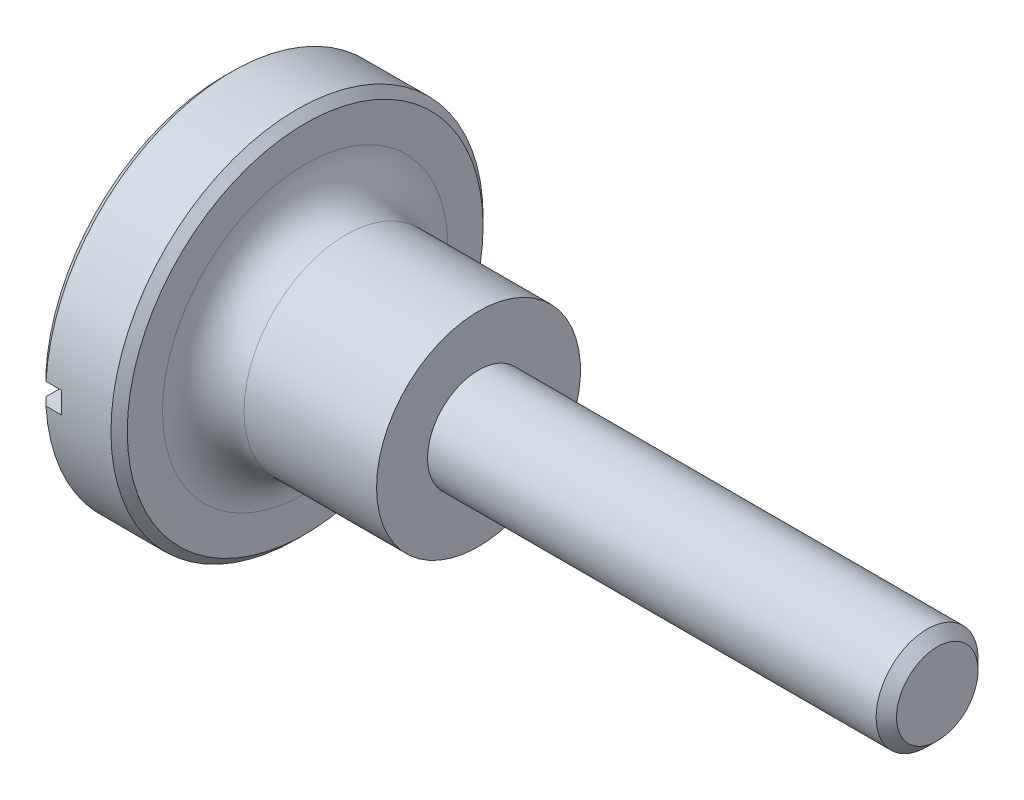
ISO-10303-21;
HEADER;
FILE_DESCRIPTION(('STEP AP214'),'2;1');
FILE_NAME('part.step','',(''),(''),'','','');
FILE_SCHEMA(('AUTOMOTIVE_DESIGN { 1 0 10303 214 1 1 1 1 }'));
ENDSEC;
DATA;
#1=APPLICATION_CONTEXT('core data for automotive mechanical design processes');
#2=APPLICATION_PROTOCOL_DEFINITION('international standard','automotive_design',2000,#1);
#3=PRODUCT_CONTEXT('',#1,'mechanical');
#4=PRODUCT('Part','Part','',(#3));
#5=PRODUCT_RELATED_PRODUCT_CATEGORY('part','',(#4));
#6=PRODUCT_DEFINITION_FORMATION('','',#4);
#7=PRODUCT_DEFINITION_CONTEXT('part definition',#1,'design');
#8=PRODUCT_DEFINITION('design','',#6,#7);
#9=PRODUCT_DEFINITION_SHAPE('','',#8);
#10=(LENGTH_UNIT() NAMED_UNIT(*) SI_UNIT(.MILLI.,.METRE.));
#11=(NAMED_UNIT(*) PLANE_ANGLE_UNIT() SI_UNIT($,.RADIAN.));
#12=(NAMED_UNIT(*) SI_UNIT($,.STERADIAN.) SOLID_ANGLE_UNIT());
#13=UNCERTAINTY_MEASURE_WITH_UNIT(LENGTH_MEASURE(1.E-05),#10,'distance_accuracy_value','');
#14=(GEOMETRIC_REPRESENTATION_CONTEXT(3) GLOBAL_UNCERTAINTY_ASSIGNED_CONTEXT((#13)) GLOBAL_UNIT_ASSIGNED_CONTEXT((#10,
#11,#12)) REPRESENTATION_CONTEXT('',''));
#15=CARTESIAN_POINT('',(0.,0.,0.));
#16=DIRECTION('',(0.,0.,1.));
#17=DIRECTION('',(1.,0.,0.));
#18=AXIS2_PLACEMENT_3D('',#15,#16,#17);
#19=CARTESIAN_POINT('',(0.799999999999999,0.,0.));
#20=DIRECTION('',(1.,0.,0.));
#21=DIRECTION('',(0.,0.,-1.));
#22=AXIS2_PLACEMENT_3D('',#19,#20,#21);
#23=CONICAL_SURFACE('',#22,18.25,0.785398163397448);
#24=CARTESIAN_POINT('',(0.799999999999999,0.,0.));
#25=DIRECTION('',(-1.,0.,0.));
#26=DIRECTION('',(0.,0.,1.));
#27=AXIS2_PLACEMENT_3D('',#24,#25,#26);
#28=CIRCLE('',#27,18.25);
#29=CARTESIAN_POINT('',(0.799999999999998,1.05069502627557,18.2197294151631));
#30=VERTEX_POINT('',#29);
#31=CARTESIAN_POINT('',(0.799999999999998,1.05069502627557,-18.2197294151631));
#32=VERTEX_POINT('',#31);
#33=EDGE_CURVE('E163',#30,#32,#28,.T.);
#34=ORIENTED_EDGE('',*,*,#33,.T.);
#35=CARTESIAN_POINT('',(22.7054596423781,1.05069502627557,-40.141711212309));
#36=CARTESIAN_POINT('',(21.3218955090069,1.05069502627557,-38.7576692769317));
#37=CARTESIAN_POINT('',(19.9383521895843,1.05069502627557,-37.3736065317238));
#38=CARTESIAN_POINT('',(17.1713337692233,1.05069502627557,-34.6054114647262));
#39=CARTESIAN_POINT('',(15.7878586683194,1.05069502627557,-33.221279142902));
#40=CARTESIAN_POINT('',(13.0209888236895,1.05069502627557,-30.4529025056026));
#41=CARTESIAN_POINT('',(11.637594081065,1.05069502627557,-29.0686581890265));
#42=CARTESIAN_POINT('',(8.87095102702407,1.05069502627557,-26.3000245733637));
#43=CARTESIAN_POINT('',(7.48770271553655,1.05069502627557,-24.9156352743482));
#44=CARTESIAN_POINT('',(4.71691298519449,1.05069502627557,-22.1420843913738));
#45=CARTESIAN_POINT('',(3.32937234539765,1.05069502627557,-20.7529220291287));
#46=CARTESIAN_POINT('',(0.554702480333594,1.05069502627557,-17.9741824319161));
#47=CARTESIAN_POINT('',(-0.832426744342287,1.05069502627557,-16.584605196358));
#48=CARTESIAN_POINT('',(-2.91246387448338,1.05069502627557,-14.4995940597288));
#49=CARTESIAN_POINT('',(-3.60569764985362,1.05069502627557,-13.8044852928888));
#50=CARTESIAN_POINT('',(-4.99181820407278,1.05069502627557,-12.4139210679398));
#51=CARTESIAN_POINT('',(-5.68470498272254,1.05069502627557,-11.7184656096322));
#52=CARTESIAN_POINT('',(-7.06991038127239,1.05069502627557,-10.3269924387228));
#53=CARTESIAN_POINT('',(-7.76222900267128,1.05069502627557,-9.63097472761383));
#54=CARTESIAN_POINT('',(-8.79989856545217,1.05069502627557,-8.58614586757556));
#55=CARTESIAN_POINT('',(-9.14565353097132,1.05069502627557,-8.23773602746357));
#56=CARTESIAN_POINT('',(-9.83676739853523,1.05069502627557,-7.54052380410372));
#57=CARTESIAN_POINT('',(-10.1821263007141,1.05069502627557,-7.19172142098885));
#58=CARTESIAN_POINT('',(-10.7159639305549,1.05069502627557,-6.65162469528891));
#59=CARTESIAN_POINT('',(-10.9046548503662,1.05069502627557,-6.46054011130738));
#60=CARTESIAN_POINT('',(-11.2817992041306,1.05069502627557,-6.07813646781248));
#61=CARTESIAN_POINT('',(-11.4702526379446,1.05069502627557,-5.88681740816187));
#62=CARTESIAN_POINT('',(-11.8467750718534,1.05069502627557,-5.50394231097374));
#63=CARTESIAN_POINT('',(-12.0348441896145,1.05069502627557,-5.31238638921506));
#64=CARTESIAN_POINT('',(-12.4105497445625,1.05069502627557,-4.92885122343311));
#65=CARTESIAN_POINT('',(-12.5981861822786,1.05069502627557,-4.73687197992837));
#66=CARTESIAN_POINT('',(-13.0361596107767,1.05069502627557,-4.28735976639499));
#67=CARTESIAN_POINT('',(-13.2862597171927,1.05069502627557,-4.02959543907187));
#68=CARTESIAN_POINT('',(-13.6600997883479,1.05069502627557,-3.64150646036757));
#69=CARTESIAN_POINT('',(-13.7845392226394,1.05069502627557,-3.51185626275503));
#70=CARTESIAN_POINT('',(-14.0327604671652,1.05069502627557,-3.2519299203883));
#71=CARTESIAN_POINT('',(-14.1565422820007,1.05069502627557,-3.12165378002593));
#72=CARTESIAN_POINT('',(-14.4450744670868,1.05069502627557,-2.8158579478936));
#73=CARTESIAN_POINT('',(-14.6094642817693,1.05069502627557,-2.63999599520794));
#74=CARTESIAN_POINT('',(-14.8537361720474,1.05069502627557,-2.37440544554177));
#75=CARTESIAN_POINT('',(-14.9346935345884,1.05069502627557,-2.28566677898999));
#76=CARTESIAN_POINT('',(-15.0956109094812,1.05069502627557,-2.10729289004238));
#77=CARTESIAN_POINT('',(-15.175570960857,1.05069502627557,-2.0176577029756));
#78=CARTESIAN_POINT('',(-15.3078557225913,1.05069502627557,-1.86699022439624));
#79=CARTESIAN_POINT('',(-15.3605734224291,1.05069502627557,-1.80630336848669));
#80=CARTESIAN_POINT('',(-15.4651721390286,1.05069502627557,-1.68421365297166));
#81=CARTESIAN_POINT('',(-15.5170531768065,1.05069502627557,-1.62281081141801));
#82=CARTESIAN_POINT('',(-15.6200289076893,1.05069502627557,-1.49868100476498));
#83=CARTESIAN_POINT('',(-15.6711164408263,1.05069502627557,-1.4359480794767));
#84=CARTESIAN_POINT('',(-15.7717279960132,1.05069502627557,-1.30924488933983));
#85=CARTESIAN_POINT('',(-15.821252186291,1.05069502627557,-1.24527475882706));
#86=CARTESIAN_POINT('',(-15.91873580845,1.05069502627557,-1.11477529236224));
#87=CARTESIAN_POINT('',(-15.9666646656014,1.05069502627557,-1.04822294559038));
#88=CARTESIAN_POINT('',(-16.0591623796834,1.05069502627557,-0.91265187122596));
#89=CARTESIAN_POINT('',(-16.1037266087394,1.05069502627557,-0.843629932346555));
#90=CARTESIAN_POINT('',(-16.1870616735425,1.05069502627557,-0.703026328508115));
#91=CARTESIAN_POINT('',(-16.2258845802967,1.05069502627557,-0.631476041085821));
#92=CARTESIAN_POINT('',(-16.2948566347539,1.05069502627557,-0.484334169730715));
#93=CARTESIAN_POINT('',(-16.3250332401389,1.05069502627557,-0.40875630360844));
#94=CARTESIAN_POINT('',(-16.359046949098,1.05069502627557,-0.2955740700368));
#95=CARTESIAN_POINT('',(-16.368293533681,1.05069502627557,-0.259602036996158));
#96=CARTESIAN_POINT('',(-16.383395126019,1.05069502627557,-0.186941871963766));
#97=CARTESIAN_POINT('',(-16.3892506059917,1.05069502627557,-0.150253840411986));
#98=CARTESIAN_POINT('',(-16.3971456964461,1.05069502627557,-0.076639264728557));
#99=CARTESIAN_POINT('',(-16.3992034455131,1.05069502627557,-0.0397147040488211));
#100=CARTESIAN_POINT('',(-16.3993991244039,1.05069502627557,0.0341463833579337));
#101=CARTESIAN_POINT('',(-16.3975369438116,1.05069502627557,0.0710829103927176));
#102=CARTESIAN_POINT('',(-16.3900577566977,1.05069502627557,0.144360866685056));
#103=CARTESIAN_POINT('',(-16.3844613479603,1.05069502627557,0.180704446113591));
#104=CARTESIAN_POINT('',(-16.3699163978638,1.05069502627557,0.252717641946318));
#105=CARTESIAN_POINT('',(-16.3609664169376,1.05069502627557,0.288386961998196));
#106=CARTESIAN_POINT('',(-16.3401510082542,1.05069502627557,0.359103959469757));
#107=CARTESIAN_POINT('',(-16.3282669840914,1.05069502627557,0.39414607982119));
#108=CARTESIAN_POINT('',(-16.3021331386188,1.05069502627557,0.463317303370552));
#109=CARTESIAN_POINT('',(-16.2878836994788,1.05069502627557,0.497446553024417));
#110=CARTESIAN_POINT('',(-16.2453698848379,1.05069502627557,0.591696183221425));
#111=CARTESIAN_POINT('',(-16.2149856956362,1.05069502627557,0.650856474039938));
#112=CARTESIAN_POINT('',(-16.1500902100597,1.05069502627557,0.766888218818552));
#113=CARTESIAN_POINT('',(-16.1155743137932,1.05069502627557,0.823757025736368));
#114=CARTESIAN_POINT('',(-16.0435935142637,1.05069502627557,0.935879540283397));
#115=CARTESIAN_POINT('',(-16.0061181110628,1.05069502627557,0.991126447260319));
#116=CARTESIAN_POINT('',(-15.9291910371676,1.05069502627557,1.10017737966071));
#117=CARTESIAN_POINT('',(-15.8897402398733,1.05069502627557,1.15398202688759));
#118=CARTESIAN_POINT('',(-15.8090139079938,1.05069502627557,1.26099932527588));
#119=CARTESIAN_POINT('',(-15.7677246509738,1.05069502627557,1.31420157461681));
#120=CARTESIAN_POINT('',(-15.684047699361,1.05069502627557,1.41973949479999));
#121=CARTESIAN_POINT('',(-15.6416599055513,1.05069502627557,1.47207508666345));
#122=CARTESIAN_POINT('',(-15.5561519971261,1.05069502627557,1.57593353566253));
#123=CARTESIAN_POINT('',(-15.5130338701213,1.05069502627557,1.62745803342224));
#124=CARTESIAN_POINT('',(-15.4261510066102,1.05069502627557,1.72995410815996));
#125=CARTESIAN_POINT('',(-15.3823862967691,1.05069502627557,1.78092570779018));
#126=CARTESIAN_POINT('',(-15.2522627794616,1.05069502627557,1.93094394039141));
#127=CARTESIAN_POINT('',(-15.165182867769,1.05069502627557,2.02936467284357));
#128=CARTESIAN_POINT('',(-14.9897287944959,1.05069502627557,2.22504752864071));
#129=CARTESIAN_POINT('',(-14.901354575936,1.05069502627557,2.32230960063414));
#130=CARTESIAN_POINT('',(-14.7236859357996,1.05069502627557,2.51601215901551));
#131=CARTESIAN_POINT('',(-14.6343913945296,1.05069502627557,2.61245253548014));
#132=CARTESIAN_POINT('',(-14.4551394078056,1.05069502627557,2.80471574176896));
#133=CARTESIAN_POINT('',(-14.3651819566941,1.05069502627557,2.90053856630961));
#134=CARTESIAN_POINT('',(-14.0943601248874,1.05069502627557,3.18754022202574));
#135=CARTESIAN_POINT('',(-13.9127583654684,1.05069502627557,3.37802279228208));
#136=CARTESIAN_POINT('',(-13.5483954860556,1.05069502627557,3.75784378977503));
#137=CARTESIAN_POINT('',(-13.3656344574804,1.05069502627557,3.94718230498658));
#138=CARTESIAN_POINT('',(-13.000850168885,1.05069502627557,4.32355192227148));
#139=CARTESIAN_POINT('',(-12.8188332533627,1.05069502627557,4.51058917654747));
#140=CARTESIAN_POINT('',(-12.454272708425,1.05069502627557,4.88415662469749));
#141=CARTESIAN_POINT('',(-12.2717290684099,1.05069502627557,5.07068680821838));
#142=CARTESIAN_POINT('',(-11.9063556429252,1.05069502627557,5.44328614712869));
#143=CARTESIAN_POINT('',(-11.7235260430244,1.05069502627557,5.62935548454737));
#144=CARTESIAN_POINT('',(-11.3575880717067,1.05069502627557,6.00121730513887));
#145=CARTESIAN_POINT('',(-11.1744797021521,1.05069502627557,6.1870097901447));
#146=CARTESIAN_POINT('',(-10.6244201687919,1.05069502627557,6.7444996864077));
#147=CARTESIAN_POINT('',(-10.2571521391073,1.05069502627557,7.11588441384723));
#148=CARTESIAN_POINT('',(-9.52209469292365,1.05069502627557,7.85813763147141));
#149=CARTESIAN_POINT('',(-9.15430527611094,1.05069502627557,8.22900612134518));
#150=CARTESIAN_POINT('',(-8.05042435817209,1.05069502627557,9.34110840041143));
#151=CARTESIAN_POINT('',(-7.31382306921161,1.05069502627557,10.0818360872758));
#152=CARTESIAN_POINT('',(-5.83981087988442,1.05069502627557,11.5627613032011));
#153=CARTESIAN_POINT('',(-5.10239985368051,1.05069502627557,12.3029587069204));
#154=CARTESIAN_POINT('',(-3.62718167940806,1.05069502627557,13.7829563159493));
#155=CARTESIAN_POINT('',(-2.88937453197535,1.05069502627557,14.5227565218927));
#156=CARTESIAN_POINT('',(-1.41109299203526,1.05069502627557,16.0045353244227));
#157=CARTESIAN_POINT('',(-0.670617786444525,1.05069502627557,16.7465131097033));
#158=CARTESIAN_POINT('',(0.810500759873604,1.05069502627557,18.230301477086));
#159=CARTESIAN_POINT('',(1.55114410067279,1.05069502627557,18.9721120591165));
#160=CARTESIAN_POINT('',(3.77316906063362,1.05069502627557,21.197293849754));
#161=CARTESIAN_POINT('',(5.25472316592608,1.05069502627557,22.6804928098259));
#162=CARTESIAN_POINT('',(8.06896911100145,1.05069502627557,25.4973934249849));
#163=CARTESIAN_POINT('',(9.40163731628034,1.05069502627557,26.8311186948468));
#164=CARTESIAN_POINT('',(12.0671260134411,1.05069502627557,29.4984618039457));
#165=CARTESIAN_POINT('',(13.3999465075041,1.05069502627557,30.8320796410031));
#166=CARTESIAN_POINT('',(16.061525884497,1.05069502627557,33.4950786089805));
#167=CARTESIAN_POINT('',(17.3902844987594,1.05069502627557,34.8244600084325));
#168=CARTESIAN_POINT('',(20.0478420667661,1.05069502627557,37.4831378970394));
#169=CARTESIAN_POINT('',(21.3766410194597,1.05069502627557,38.8124343872447));
#170=CARTESIAN_POINT('',(22.7054596423781,1.05069502627557,40.141711212309));
#171=B_SPLINE_CURVE_WITH_KNOTS('',3,(#35,#36,#37,#38,#39,#40,#41,#42,#43,#44,#45,#46,#47,#48,
#49,#50,#51,#52,#53,#54,#55,#56,#57,#58,#59,#60,#61,#62,#63,#64,#65,#66,#67,#68,#69,#70,#71,#72,
#73,#74,#75,#76,#77,#78,#79,#80,#81,#82,#83,#84,#85,#86,#87,#88,#89,#90,#91,#92,#93,#94,#95,#96,
#97,#98,#99,#100,#101,#102,#103,#104,#105,#106,#107,#108,#109,#110,#111,#112,#113,#114,#115,
#116,#117,#118,#119,#120,#121,#122,#123,#124,#125,#126,#127,#128,#129,#130,#131,#132,#133,#134,
#135,#136,#137,#138,#139,#140,#141,#142,#143,#144,#145,#146,#147,#148,#149,#150,#151,#152,#153,
#154,#155,#156,#157,#158,#159,#160,#161,#162,#163,#164,#165,#166,#167,#168,#169,#170),
.UNSPECIFIED.,.F.,.F.,(4,2,2,2,2,2,2,2,2,2,2,2,2,2,2,2,2,2,2,2,2,2,2,2,2,2,2,2,2,2,2,2,2,2,2,2,
2,2,2,2,2,2,2,2,2,2,2,2,2,2,2,2,2,2,2,2,2,2,2,2,2,2,2,2,2,2,2,4),(0.,5.87097914730624,
11.7419612386698,17.6130105498529,23.4840569937888,29.3743345399984,35.2646205116594,
38.2097423855863,41.1548659480556,44.0999817161878,45.5725382313445,47.045094247694,
47.8507355932612,48.6563774105971,49.4617170955565,50.2670557946135,51.3445152541151,
51.8836320961762,52.4227451611202,53.1449153550438,53.5052685362452,53.8656075725811,
54.1067626927622,54.3479117458949,54.5906045377739,54.8332711243757,55.0792491369838,
55.325559538799,55.5694773240897,55.8126117004144,55.923901368413,56.0351755353907,
56.1459168494792,56.2566612829579,56.3667998514488,56.4769857527061,56.5878888125356,
56.6987739716502,56.8980182640572,57.0974864780867,57.2976972530312,57.4978202753432,
57.6998347796391,57.9018675933852,58.1034185773956,58.3049612724452,58.6991822632134,
59.0934206612392,59.4877109960472,59.8820046997897,60.6715294294929,61.4609926537189,
62.2439456090628,63.0269144321019,63.8094970300561,64.592074423425,66.1590168796825,
67.7259602791218,70.8598593636645,73.9943456500922,77.12882692013,80.2735861948392,
83.4183468148428,89.707538708076,95.3638138680699,101.020183990369,106.658950630273,
112.297622664435),.UNSPECIFIED.);
#172=CARTESIAN_POINT('',(0.,1.05069502627557,-17.4183391849441));
#173=VERTEX_POINT('',#172);
#174=EDGE_CURVE('E55',#32,#173,#171,.T.);
#175=ORIENTED_EDGE('',*,*,#174,.T.);
#176=CARTESIAN_POINT('',(0.,0.,0.));
#177=DIRECTION('',(-1.,0.,0.));
#178=DIRECTION('',(0.,0.,1.));
#179=AXIS2_PLACEMENT_3D('',#176,#177,#178);
#180=CIRCLE('',#179,17.45);
#181=CARTESIAN_POINT('',(0.,1.05069502627557,17.4183391849441));
#182=VERTEX_POINT('',#181);
#183=EDGE_CURVE('E172',#182,#173,#180,.T.);
#184=ORIENTED_EDGE('',*,*,#183,.F.);
#185=EDGE_CURVE('E109',#182,#30,#171,.T.);
#186=ORIENTED_EDGE('',*,*,#185,.T.);
#187=EDGE_LOOP('',(#34,#175,#184,#186));
#188=FACE_BOUND('',#187,.T.);
#189=ADVANCED_FACE('F32',(#188),#23,.T.);
#190=CARTESIAN_POINT('',(0.,0.,0.));
#191=DIRECTION('',(-1.,0.,0.));
#192=DIRECTION('',(0.,0.,1.));
#193=AXIS2_PLACEMENT_3D('',#190,#191,#192);
#194=PLANE('',#193);
#195=DIRECTION('',(0.,0.,-1.));
#196=VECTOR('',#195,1.);
#197=CARTESIAN_POINT('',(0.,1.05069502627557,0.));
#198=LINE('',#197,#196);
#199=EDGE_CURVE('E186',#182,#173,#198,.T.);
#200=ORIENTED_EDGE('',*,*,#199,.F.);
#201=ORIENTED_EDGE('',*,*,#183,.T.);
#202=EDGE_LOOP('',(#200,#201));
#203=FACE_BOUND('',#202,.T.);
#204=ADVANCED_FACE('F149',(#203),#194,.T.);
#205=CARTESIAN_POINT('',(-25.4,0.,0.));
#206=DIRECTION('',(-1.,0.,0.));
#207=DIRECTION('',(0.,0.,1.));
#208=AXIS2_PLACEMENT_3D('',#205,#206,#207);
#209=CYLINDRICAL_SURFACE('',#208,5.);
#210=CARTESIAN_POINT('',(69.,0.,0.));
#211=DIRECTION('',(-1.,0.,0.));
#212=DIRECTION('',(0.,0.,1.));
#213=AXIS2_PLACEMENT_3D('',#210,#211,#212);
#214=CIRCLE('',#213,5.);
#215=CARTESIAN_POINT('',(69.,0.,5.));
#216=VERTEX_POINT('',#215);
#217=EDGE_CURVE('E315',#216,#216,#214,.T.);
#218=ORIENTED_EDGE('',*,*,#217,.T.);
#219=EDGE_LOOP('',(#218));
#220=FACE_BOUND('',#219,.T.);
#221=CARTESIAN_POINT('',(25.,0.,0.));
#222=DIRECTION('',(-1.,0.,0.));
#223=DIRECTION('',(0.,0.,1.));
#224=AXIS2_PLACEMENT_3D('',#221,#222,#223);
#225=CIRCLE('',#224,5.);
#226=CARTESIAN_POINT('',(25.,0.,5.));
#227=VERTEX_POINT('',#226);
#228=EDGE_CURVE('E181',#227,#227,#225,.T.);
#229=ORIENTED_EDGE('',*,*,#228,.F.);
#230=EDGE_LOOP('',(#229));
#231=FACE_BOUND('',#230,.T.);
#232=ADVANCED_FACE('F155',(#220,#231),#209,.T.);
#233=CARTESIAN_POINT('',(25.,9.99999999999999,0.));
#234=DIRECTION('',(1.,0.,0.));
#235=DIRECTION('',(0.,0.,-1.));
#236=AXIS2_PLACEMENT_3D('',#233,#234,#235);
#237=PLANE('',#236);
#238=ORIENTED_EDGE('',*,*,#228,.T.);
#239=EDGE_LOOP('',(#238));
#240=FACE_BOUND('',#239,.T.);
#241=CARTESIAN_POINT('',(25.,0.,0.));
#242=DIRECTION('',(-1.,0.,0.));
#243=DIRECTION('',(0.,0.,1.));
#244=AXIS2_PLACEMENT_3D('',#241,#242,#243);
#245=CIRCLE('',#244,9.99999999999999);
#246=CARTESIAN_POINT('',(25.,0.,9.99999999999999));
#247=VERTEX_POINT('',#246);
#248=EDGE_CURVE('E178',#247,#247,#245,.T.);
#249=ORIENTED_EDGE('',*,*,#248,.F.);
#250=EDGE_LOOP('',(#249));
#251=FACE_BOUND('',#250,.T.);
#252=ADVANCED_FACE('F202',(#240,#251),#237,.T.);
#253=CARTESIAN_POINT('',(-25.4,0.,0.));
#254=DIRECTION('',(-1.,0.,0.));
#255=DIRECTION('',(0.,0.,1.));
#256=AXIS2_PLACEMENT_3D('',#253,#254,#255);
#257=CYLINDRICAL_SURFACE('',#256,9.99999999999999);
#258=CARTESIAN_POINT('',(12.,0.,0.));
#259=DIRECTION('',(-1.,0.,0.));
#260=DIRECTION('',(0.,0.,1.));
#261=AXIS2_PLACEMENT_3D('',#258,#259,#260);
#262=CIRCLE('',#261,9.99999999999999);
#263=CARTESIAN_POINT('',(12.,0.,9.99999999999999));
#264=VERTEX_POINT('',#263);
#265=EDGE_CURVE('E11',#264,#264,#262,.F.);
#266=ORIENTED_EDGE('',*,*,#265,.T.);
#267=EDGE_LOOP('',(#266));
#268=FACE_BOUND('',#267,.T.);
#269=ORIENTED_EDGE('',*,*,#248,.T.);
#270=EDGE_LOOP('',(#269));
#271=FACE_BOUND('',#270,.T.);
#272=ADVANCED_FACE('F199',(#268,#271),#257,.T.);
#273=CARTESIAN_POINT('',(8.,9.99999999999999,0.));
#274=DIRECTION('',(-1.,0.,0.));
#275=DIRECTION('',(0.,0.,1.));
#276=AXIS2_PLACEMENT_3D('',#273,#274,#275);
#277=PLANE('',#276);
#278=CARTESIAN_POINT('',(8.,0.,0.));
#279=DIRECTION('',(-1.,0.,0.));
#280=DIRECTION('',(0.,0.,1.));
#281=AXIS2_PLACEMENT_3D('',#278,#279,#280);
#282=CIRCLE('',#281,14.);
#283=CARTESIAN_POINT('',(8.,0.,14.));
#284=VERTEX_POINT('',#283);
#285=EDGE_CURVE('E40',#284,#284,#282,.T.);
#286=ORIENTED_EDGE('',*,*,#285,.T.);
#287=EDGE_LOOP('',(#286));
#288=FACE_BOUND('',#287,.T.);
#289=CARTESIAN_POINT('',(7.99999999999999,0.,0.));
#290=DIRECTION('',(-1.,0.,0.));
#291=DIRECTION('',(0.,0.,1.));
#292=AXIS2_PLACEMENT_3D('',#289,#290,#291);
#293=CIRCLE('',#292,17.45);
#294=CARTESIAN_POINT('',(7.99999999999999,0.,17.45));
#295=VERTEX_POINT('',#294);
#296=EDGE_CURVE('E170',#295,#295,#293,.T.);
#297=ORIENTED_EDGE('',*,*,#296,.F.);
#298=EDGE_LOOP('',(#297));
#299=FACE_BOUND('',#298,.T.);
#300=ADVANCED_FACE('F190',(#288,#299),#277,.F.);
#301=CARTESIAN_POINT('',(7.2,0.,0.));
#302=DIRECTION('',(-1.,0.,0.));
#303=DIRECTION('',(0.,0.,1.));
#304=AXIS2_PLACEMENT_3D('',#301,#302,#303);
#305=CONICAL_SURFACE('',#304,18.25,0.785398163397453);
#306=ORIENTED_EDGE('',*,*,#296,.T.);
#307=EDGE_LOOP('',(#306));
#308=FACE_BOUND('',#307,.T.);
#309=CARTESIAN_POINT('',(7.2,0.,0.));
#310=DIRECTION('',(-1.,0.,0.));
#311=DIRECTION('',(0.,0.,1.));
#312=AXIS2_PLACEMENT_3D('',#309,#310,#311);
#313=CIRCLE('',#312,18.25);
#314=CARTESIAN_POINT('',(7.2,0.,18.25));
#315=VERTEX_POINT('',#314);
#316=EDGE_CURVE('E167',#315,#315,#313,.T.);
#317=ORIENTED_EDGE('',*,*,#316,.F.);
#318=EDGE_LOOP('',(#317));
#319=FACE_BOUND('',#318,.T.);
#320=ADVANCED_FACE('F216',(#308,#319),#305,.T.);
#321=CARTESIAN_POINT('',(-25.4,0.,0.));
#322=DIRECTION('',(-1.,0.,0.));
#323=DIRECTION('',(0.,0.,1.));
#324=AXIS2_PLACEMENT_3D('',#321,#322,#323);
#325=CYLINDRICAL_SURFACE('',#324,18.25);
#326=DIRECTION('',(-1.,0.,0.));
#327=VECTOR('',#326,1.);
#328=CARTESIAN_POINT('',(-25.4,1.05069502627557,-18.2197294151631));
#329=LINE('',#328,#327);
#330=CARTESIAN_POINT('',(2.34655222534877,1.05069502627557,-18.2197294151631));
#331=VERTEX_POINT('',#330);
#332=EDGE_CURVE('E318',#32,#331,#329,.F.);
#333=ORIENTED_EDGE('',*,*,#332,.F.);
#334=ORIENTED_EDGE('',*,*,#33,.F.);
#335=DIRECTION('',(-1.,0.,0.));
#336=VECTOR('',#335,1.);
#337=CARTESIAN_POINT('',(-25.4,1.05069502627557,18.2197294151631));
#338=LINE('',#337,#336);
#339=CARTESIAN_POINT('',(2.34655222534877,1.05069502627557,18.2197294151631));
#340=VERTEX_POINT('',#339);
#341=EDGE_CURVE('E125',#340,#30,#338,.T.);
#342=ORIENTED_EDGE('',*,*,#341,.F.);
#343=CARTESIAN_POINT('',(2.34655222534877,0.,0.));
#344=DIRECTION('',(1.,0.,0.));
#345=DIRECTION('',(0.,1.,0.));
#346=AXIS2_PLACEMENT_3D('',#343,#344,#345);
#347=CIRCLE('',#346,18.25);
#348=CARTESIAN_POINT('',(2.34655222534877,-1.05069502627557,18.2197294151631));
#349=VERTEX_POINT('',#348);
#350=EDGE_CURVE('E94',#349,#340,#347,.F.);
#351=ORIENTED_EDGE('',*,*,#350,.F.);
#352=DIRECTION('',(-1.,0.,0.));
#353=VECTOR('',#352,1.);
#354=CARTESIAN_POINT('',(-25.4,-1.05069502627557,18.2197294151631));
#355=LINE('',#354,#353);
#356=CARTESIAN_POINT('',(0.799999999999998,-1.05069502627557,18.2197294151631));
#357=VERTEX_POINT('',#356);
#358=EDGE_CURVE('E100',#357,#349,#355,.F.);
#359=ORIENTED_EDGE('',*,*,#358,.F.);
#360=CARTESIAN_POINT('',(0.799999999999998,-1.05069502627557,-18.2197294151631));
#361=VERTEX_POINT('',#360);
#362=EDGE_CURVE('E106',#361,#357,#28,.T.);
#363=ORIENTED_EDGE('',*,*,#362,.F.);
#364=DIRECTION('',(-1.,0.,0.));
#365=VECTOR('',#364,1.);
#366=CARTESIAN_POINT('',(-25.4,-1.05069502627557,-18.2197294151631));
#367=LINE('',#366,#365);
#368=CARTESIAN_POINT('',(2.34655222534877,-1.05069502627557,-18.2197294151631));
#369=VERTEX_POINT('',#368);
#370=EDGE_CURVE('E98',#369,#361,#367,.T.);
#371=ORIENTED_EDGE('',*,*,#370,.F.);
#372=EDGE_CURVE('E86',#331,#369,#347,.F.);
#373=ORIENTED_EDGE('',*,*,#372,.F.);
#374=EDGE_LOOP('',(#333,#334,#342,#351,#359,#363,#371,#373));
#375=FACE_BOUND('',#374,.T.);
#376=ORIENTED_EDGE('',*,*,#316,.T.);
#377=EDGE_LOOP('',(#376));
#378=FACE_BOUND('',#377,.T.);
#379=ADVANCED_FACE('F103',(#375,#378),#325,.T.);
#380=ORIENTED_EDGE('',*,*,#362,.T.);
#381=CARTESIAN_POINT('',(22.7054596423781,-1.05069502627557,40.141711212309));
#382=CARTESIAN_POINT('',(21.3218955090069,-1.05069502627557,38.7576692769317));
#383=CARTESIAN_POINT('',(19.9383521895843,-1.05069502627557,37.3736065317238));
#384=CARTESIAN_POINT('',(17.1713337692233,-1.05069502627557,34.6054114647262));
#385=CARTESIAN_POINT('',(15.7878586683194,-1.05069502627557,33.221279142902));
#386=CARTESIAN_POINT('',(13.0209888236895,-1.05069502627557,30.4529025056026));
#387=CARTESIAN_POINT('',(11.637594081065,-1.05069502627557,29.0686581890265));
#388=CARTESIAN_POINT('',(8.87095102702408,-1.05069502627557,26.3000245733637));
#389=CARTESIAN_POINT('',(7.48770271553655,-1.05069502627557,24.9156352743482));
#390=CARTESIAN_POINT('',(4.7169129851945,-1.05069502627557,22.1420843913738));
#391=CARTESIAN_POINT('',(3.32937234539765,-1.05069502627557,20.7529220291287));
#392=CARTESIAN_POINT('',(0.554702480333598,-1.05069502627557,17.9741824319161));
#393=CARTESIAN_POINT('',(-0.832426744342287,-1.05069502627557,16.584605196358));
#394=CARTESIAN_POINT('',(-2.91246387448339,-1.05069502627557,14.4995940597288));
#395=CARTESIAN_POINT('',(-3.60569764985362,-1.05069502627557,13.8044852928888));
#396=CARTESIAN_POINT('',(-4.99181820407278,-1.05069502627557,12.4139210679398));
#397=CARTESIAN_POINT('',(-5.68470498272254,-1.05069502627557,11.7184656096322));
#398=CARTESIAN_POINT('',(-7.06991038127239,-1.05069502627557,10.3269924387228));
#399=CARTESIAN_POINT('',(-7.76222900267129,-1.05069502627557,9.63097472761383));
#400=CARTESIAN_POINT('',(-8.79989856545218,-1.05069502627557,8.58614586757555));
#401=CARTESIAN_POINT('',(-9.14565353097132,-1.05069502627557,8.23773602746357));
#402=CARTESIAN_POINT('',(-9.83676739853523,-1.05069502627557,7.54052380410371));
#403=CARTESIAN_POINT('',(-10.1821263007141,-1.05069502627557,7.19172142098885));
#404=CARTESIAN_POINT('',(-10.7159639305549,-1.05069502627557,6.65162469528891));
#405=CARTESIAN_POINT('',(-10.9046548503662,-1.05069502627557,6.46054011130738));
#406=CARTESIAN_POINT('',(-11.2817992041306,-1.05069502627557,6.07813646781248));
#407=CARTESIAN_POINT('',(-11.4702526379446,-1.05069502627557,5.88681740816187));
#408=CARTESIAN_POINT('',(-11.8467750718534,-1.05069502627557,5.50394231097374));
#409=CARTESIAN_POINT('',(-12.0348441896145,-1.05069502627557,5.31238638921505));
#410=CARTESIAN_POINT('',(-12.4105497445625,-1.05069502627557,4.92885122343311));
#411=CARTESIAN_POINT('',(-12.5981861822786,-1.05069502627557,4.73687197992837));
#412=CARTESIAN_POINT('',(-13.0361596107767,-1.05069502627557,4.28735976639499));
#413=CARTESIAN_POINT('',(-13.2862597171927,-1.05069502627557,4.02959543907187));
#414=CARTESIAN_POINT('',(-13.6600997883479,-1.05069502627557,3.64150646036757));
#415=CARTESIAN_POINT('',(-13.7845392226394,-1.05069502627557,3.51185626275503));
#416=CARTESIAN_POINT('',(-14.0327604671652,-1.05069502627557,3.2519299203883));
#417=CARTESIAN_POINT('',(-14.1565422820007,-1.05069502627557,3.12165378002593));
#418=CARTESIAN_POINT('',(-14.4450744670868,-1.05069502627557,2.8158579478936));
#419=CARTESIAN_POINT('',(-14.6094642817693,-1.05069502627557,2.63999599520794));
#420=CARTESIAN_POINT('',(-14.8537361720474,-1.05069502627557,2.37440544554177));
#421=CARTESIAN_POINT('',(-14.9346935345884,-1.05069502627557,2.28566677898999));
#422=CARTESIAN_POINT('',(-15.0956109094811,-1.05069502627557,2.10729289004238));
#423=CARTESIAN_POINT('',(-15.175570960857,-1.05069502627557,2.0176577029756));
#424=CARTESIAN_POINT('',(-15.3078557225913,-1.05069502627557,1.86699022439624));
#425=CARTESIAN_POINT('',(-15.3605734224291,-1.05069502627557,1.80630336848669));
#426=CARTESIAN_POINT('',(-15.4651721390286,-1.05069502627557,1.68421365297166));
#427=CARTESIAN_POINT('',(-15.5170531768065,-1.05069502627557,1.62281081141801));
#428=CARTESIAN_POINT('',(-15.6200289076893,-1.05069502627557,1.49868100476498));
#429=CARTESIAN_POINT('',(-15.6711164408263,-1.05069502627557,1.4359480794767));
#430=CARTESIAN_POINT('',(-15.7717279960132,-1.05069502627557,1.30924488933983));
#431=CARTESIAN_POINT('',(-15.821252186291,-1.05069502627557,1.24527475882706));
#432=CARTESIAN_POINT('',(-15.91873580845,-1.05069502627557,1.11477529236224));
#433=CARTESIAN_POINT('',(-15.9666646656014,-1.05069502627557,1.04822294559038));
#434=CARTESIAN_POINT('',(-16.0591623796834,-1.05069502627557,0.912651871225958));
#435=CARTESIAN_POINT('',(-16.1037266087394,-1.05069502627557,0.843629932346553));
#436=CARTESIAN_POINT('',(-16.1870616735425,-1.05069502627557,0.703026328508113));
#437=CARTESIAN_POINT('',(-16.2258845802967,-1.05069502627557,0.631476041085819));
#438=CARTESIAN_POINT('',(-16.2948566347539,-1.05069502627557,0.484334169730714));
#439=CARTESIAN_POINT('',(-16.3250332401389,-1.05069502627557,0.408756303608441));
#440=CARTESIAN_POINT('',(-16.359046949098,-1.05069502627557,0.295574070036803));
#441=CARTESIAN_POINT('',(-16.368293533681,-1.05069502627557,0.259602036996162));
#442=CARTESIAN_POINT('',(-16.383395126019,-1.05069502627557,0.186941871963771));
#443=CARTESIAN_POINT('',(-16.3892506059917,-1.05069502627557,0.150253840411988));
#444=CARTESIAN_POINT('',(-16.3971456964461,-1.05069502627557,0.0766392647285568));
#445=CARTESIAN_POINT('',(-16.3992034455131,-1.05069502627557,0.039714704048821));
#446=CARTESIAN_POINT('',(-16.3993991244039,-1.05069502627557,-0.034146383357934));
#447=CARTESIAN_POINT('',(-16.3975369438116,-1.05069502627557,-0.071082910392718));
#448=CARTESIAN_POINT('',(-16.3900577566977,-1.05069502627557,-0.144360866685056));
#449=CARTESIAN_POINT('',(-16.3844613479603,-1.05069502627557,-0.180704446113592));
#450=CARTESIAN_POINT('',(-16.3699163978638,-1.05069502627557,-0.252717641946321));
#451=CARTESIAN_POINT('',(-16.3609664169376,-1.05069502627557,-0.288386961998199));
#452=CARTESIAN_POINT('',(-16.3401510082542,-1.05069502627557,-0.359103959469761));
#453=CARTESIAN_POINT('',(-16.3282669840914,-1.05069502627557,-0.394146079821194));
#454=CARTESIAN_POINT('',(-16.3021331386188,-1.05069502627557,-0.463317303370555));
#455=CARTESIAN_POINT('',(-16.2878836994788,-1.05069502627557,-0.497446553024419));
#456=CARTESIAN_POINT('',(-16.2453698848379,-1.05069502627557,-0.591696183221427));
#457=CARTESIAN_POINT('',(-16.2149856956362,-1.05069502627557,-0.650856474039942));
#458=CARTESIAN_POINT('',(-16.1500902100597,-1.05069502627557,-0.766888218818558));
#459=CARTESIAN_POINT('',(-16.1155743137932,-1.05069502627557,-0.823757025736374));
#460=CARTESIAN_POINT('',(-16.0435935142637,-1.05069502627557,-0.935879540283403));
#461=CARTESIAN_POINT('',(-16.0061181110627,-1.05069502627557,-0.991126447260325));
#462=CARTESIAN_POINT('',(-15.9291910371676,-1.05069502627557,-1.10017737966071));
#463=CARTESIAN_POINT('',(-15.8897402398733,-1.05069502627557,-1.15398202688759));
#464=CARTESIAN_POINT('',(-15.8090139079938,-1.05069502627557,-1.26099932527589));
#465=CARTESIAN_POINT('',(-15.7677246509738,-1.05069502627557,-1.31420157461682));
#466=CARTESIAN_POINT('',(-15.684047699361,-1.05069502627557,-1.4197394948));
#467=CARTESIAN_POINT('',(-15.6416599055513,-1.05069502627557,-1.47207508666345));
#468=CARTESIAN_POINT('',(-15.5561519971261,-1.05069502627557,-1.57593353566254));
#469=CARTESIAN_POINT('',(-15.5130338701213,-1.05069502627557,-1.62745803342224));
#470=CARTESIAN_POINT('',(-15.4261510066102,-1.05069502627557,-1.72995410815996));
#471=CARTESIAN_POINT('',(-15.3823862967691,-1.05069502627557,-1.78092570779019));
#472=CARTESIAN_POINT('',(-15.2522627794616,-1.05069502627557,-1.93094394039141));
#473=CARTESIAN_POINT('',(-15.165182867769,-1.05069502627557,-2.02936467284358));
#474=CARTESIAN_POINT('',(-14.9897287944959,-1.05069502627557,-2.22504752864072));
#475=CARTESIAN_POINT('',(-14.901354575936,-1.05069502627557,-2.32230960063414));
#476=CARTESIAN_POINT('',(-14.7236859357996,-1.05069502627557,-2.51601215901552));
#477=CARTESIAN_POINT('',(-14.6343913945296,-1.05069502627557,-2.61245253548015));
#478=CARTESIAN_POINT('',(-14.4551394078056,-1.05069502627557,-2.80471574176897));
#479=CARTESIAN_POINT('',(-14.3651819566941,-1.05069502627557,-2.90053856630961));
#480=CARTESIAN_POINT('',(-14.0943601248873,-1.05069502627557,-3.18754022202574));
#481=CARTESIAN_POINT('',(-13.9127583654684,-1.05069502627557,-3.37802279228209));
#482=CARTESIAN_POINT('',(-13.5483954860556,-1.05069502627557,-3.75784378977504));
#483=CARTESIAN_POINT('',(-13.3656344574804,-1.05069502627557,-3.94718230498658));
#484=CARTESIAN_POINT('',(-13.000850168885,-1.05069502627557,-4.32355192227149));
#485=CARTESIAN_POINT('',(-12.8188332533627,-1.05069502627557,-4.51058917654748));
#486=CARTESIAN_POINT('',(-12.454272708425,-1.05069502627557,-4.8841566246975));
#487=CARTESIAN_POINT('',(-12.2717290684099,-1.05069502627557,-5.07068680821839));
#488=CARTESIAN_POINT('',(-11.9063556429252,-1.05069502627557,-5.44328614712869));
#489=CARTESIAN_POINT('',(-11.7235260430244,-1.05069502627557,-5.62935548454737));
#490=CARTESIAN_POINT('',(-11.3575880717067,-1.05069502627557,-6.00121730513888));
#491=CARTESIAN_POINT('',(-11.174479702152,-1.05069502627557,-6.1870097901447));
#492=CARTESIAN_POINT('',(-10.6244201687918,-1.05069502627557,-6.74449968640771));
#493=CARTESIAN_POINT('',(-10.2571521391072,-1.05069502627557,-7.11588441384724));
#494=CARTESIAN_POINT('',(-9.52209469292364,-1.05069502627557,-7.85813763147142));
#495=CARTESIAN_POINT('',(-9.15430527611093,-1.05069502627557,-8.2290061213452));
#496=CARTESIAN_POINT('',(-8.05042435817208,-1.05069502627557,-9.34110840041145));
#497=CARTESIAN_POINT('',(-7.3138230692116,-1.05069502627557,-10.0818360872759));
#498=CARTESIAN_POINT('',(-5.8398108798844,-1.05069502627557,-11.5627613032011));
#499=CARTESIAN_POINT('',(-5.10239985368049,-1.05069502627557,-12.3029587069204));
#500=CARTESIAN_POINT('',(-3.62718167940804,-1.05069502627557,-13.7829563159493));
#501=CARTESIAN_POINT('',(-2.88937453197533,-1.05069502627557,-14.5227565218927));
#502=CARTESIAN_POINT('',(-1.41109299203524,-1.05069502627557,-16.0045353244227));
#503=CARTESIAN_POINT('',(-0.670617786444507,-1.05069502627557,-16.7465131097033));
#504=CARTESIAN_POINT('',(0.810500759873621,-1.05069502627557,-18.230301477086));
#505=CARTESIAN_POINT('',(1.55114410067281,-1.05069502627557,-18.9721120591165));
#506=CARTESIAN_POINT('',(3.77316906063364,-1.05069502627557,-21.197293849754));
#507=CARTESIAN_POINT('',(5.25472316592611,-1.05069502627557,-22.6804928098259));
#508=CARTESIAN_POINT('',(8.06896911100148,-1.05069502627557,-25.4973934249849));
#509=CARTESIAN_POINT('',(9.40163731628036,-1.05069502627557,-26.8311186948468));
#510=CARTESIAN_POINT('',(12.0671260134411,-1.05069502627557,-29.4984618039457));
#511=CARTESIAN_POINT('',(13.3999465075041,-1.05069502627557,-30.8320796410032));
#512=CARTESIAN_POINT('',(16.061525884497,-1.05069502627557,-33.4950786089806));
#513=CARTESIAN_POINT('',(17.3902844987594,-1.05069502627557,-34.8244600084325));
#514=CARTESIAN_POINT('',(20.0478420667661,-1.05069502627557,-37.4831378970394));
#515=CARTESIAN_POINT('',(21.3766410194597,-1.05069502627557,-38.8124343872447));
#516=CARTESIAN_POINT('',(22.7054596423781,-1.05069502627557,-40.141711212309));
#517=B_SPLINE_CURVE_WITH_KNOTS('',3,(#381,#382,#383,#384,#385,#386,#387,#388,#389,#390,#391,
#392,#393,#394,#395,#396,#397,#398,#399,#400,#401,#402,#403,#404,#405,#406,#407,#408,#409,#410,
#411,#412,#413,#414,#415,#416,#417,#418,#419,#420,#421,#422,#423,#424,#425,#426,#427,#428,#429,
#430,#431,#432,#433,#434,#435,#436,#437,#438,#439,#440,#441,#442,#443,#444,#445,#446,#447,#448,
#449,#450,#451,#452,#453,#454,#455,#456,#457,#458,#459,#460,#461,#462,#463,#464,#465,#466,#467,
#468,#469,#470,#471,#472,#473,#474,#475,#476,#477,#478,#479,#480,#481,#482,#483,#484,#485,#486,
#487,#488,#489,#490,#491,#492,#493,#494,#495,#496,#497,#498,#499,#500,#501,#502,#503,#504,#505,
#506,#507,#508,#509,#510,#511,#512,#513,#514,#515,#516),.UNSPECIFIED.,.F.,.F.,(4,2,2,2,2,2,2,2,
2,2,2,2,2,2,2,2,2,2,2,2,2,2,2,2,2,2,2,2,2,2,2,2,2,2,2,2,2,2,2,2,2,2,2,2,2,2,2,2,2,2,2,2,2,2,2,2,
2,2,2,2,2,2,2,2,2,2,2,4),(0.,5.87097914730623,11.7419612386698,17.6130105498529,
23.4840569937887,29.3743345399983,35.2646205116594,38.2097423855863,41.1548659480556,
44.0999817161878,45.5725382313445,47.045094247694,47.8507355932612,48.6563774105971,
49.4617170955565,50.2670557946135,51.3445152541151,51.8836320961762,52.4227451611202,
53.1449153550438,53.5052685362452,53.8656075725811,54.1067626927622,54.3479117458948,
54.5906045377739,54.8332711243757,55.0792491369838,55.325559538799,55.5694773240897,
55.8126117004144,55.923901368413,56.0351755353907,56.1459168494792,56.2566612829579,
56.3667998514488,56.4769857527061,56.5878888125356,56.6987739716502,56.8980182640572,
57.0974864780867,57.2976972530312,57.4978202753432,57.6998347796391,57.9018675933852,
58.1034185773956,58.3049612724452,58.6991822632134,59.0934206612392,59.4877109960472,
59.8820046997897,60.6715294294929,61.4609926537189,62.2439456090628,63.0269144321019,
63.8094970300561,64.592074423425,66.1590168796825,67.7259602791218,70.8598593636645,
73.9943456500922,77.12882692013,80.2735861948392,83.4183468148428,89.7075387080761,
95.3638138680699,101.020183990369,106.658950630273,112.297622664435),.UNSPECIFIED.);
#518=CARTESIAN_POINT('',(0.,-1.05069502627557,17.4183391849441));
#519=VERTEX_POINT('',#518);
#520=EDGE_CURVE('E107',#357,#519,#517,.T.);
#521=ORIENTED_EDGE('',*,*,#520,.T.);
#522=CARTESIAN_POINT('',(0.,-1.05069502627557,-17.4183391849441));
#523=VERTEX_POINT('',#522);
#524=EDGE_CURVE('E321',#523,#519,#180,.T.);
#525=ORIENTED_EDGE('',*,*,#524,.F.);
#526=EDGE_CURVE('E47',#523,#361,#517,.T.);
#527=ORIENTED_EDGE('',*,*,#526,.T.);
#528=EDGE_LOOP('',(#380,#521,#525,#527));
#529=FACE_BOUND('',#528,.T.);
#530=ADVANCED_FACE('F127',(#529),#23,.T.);
#531=DIRECTION('',(0.,0.,1.));
#532=VECTOR('',#531,1.);
#533=CARTESIAN_POINT('',(0.,-1.05069502627557,0.));
#534=LINE('',#533,#532);
#535=EDGE_CURVE('E184',#523,#519,#534,.T.);
#536=ORIENTED_EDGE('',*,*,#535,.F.);
#537=ORIENTED_EDGE('',*,*,#524,.T.);
#538=EDGE_LOOP('',(#536,#537));
#539=FACE_BOUND('',#538,.T.);
#540=ADVANCED_FACE('F145',(#539),#194,.T.);
#541=CARTESIAN_POINT('',(70.,4.00000000000001,0.));
#542=DIRECTION('',(1.,0.,0.));
#543=DIRECTION('',(0.,0.,-1.));
#544=AXIS2_PLACEMENT_3D('',#541,#542,#543);
#545=PLANE('',#544);
#546=CARTESIAN_POINT('',(70.,0.,0.));
#547=DIRECTION('',(-1.,0.,0.));
#548=DIRECTION('',(0.,0.,1.));
#549=AXIS2_PLACEMENT_3D('',#546,#547,#548);
#550=CIRCLE('',#549,4.00000000000001);
#551=CARTESIAN_POINT('',(70.,0.,4.00000000000001));
#552=VERTEX_POINT('',#551);
#553=EDGE_CURVE('E317',#552,#552,#550,.T.);
#554=ORIENTED_EDGE('',*,*,#553,.F.);
#555=EDGE_LOOP('',(#554));
#556=FACE_BOUND('',#555,.T.);
#557=ADVANCED_FACE('F142',(#556),#545,.T.);
#558=CARTESIAN_POINT('',(69.,0.,0.));
#559=DIRECTION('',(-1.,0.,0.));
#560=DIRECTION('',(0.,0.,1.));
#561=AXIS2_PLACEMENT_3D('',#558,#559,#560);
#562=CONICAL_SURFACE('',#561,5.,0.785398163397446);
#563=ORIENTED_EDGE('',*,*,#553,.T.);
#564=EDGE_LOOP('',(#563));
#565=FACE_BOUND('',#564,.T.);
#566=ORIENTED_EDGE('',*,*,#217,.F.);
#567=EDGE_LOOP('',(#566));
#568=FACE_BOUND('',#567,.T.);
#569=ADVANCED_FACE('F135',(#565,#568),#562,.T.);
#570=CARTESIAN_POINT('',(-2.34655222534877,1.05069502627557,-18.25));
#571=DIRECTION('',(0.,1.,0.));
#572=DIRECTION('',(0.,0.,1.));
#573=AXIS2_PLACEMENT_3D('',#570,#571,#572);
#574=PLANE('',#573);
#575=ORIENTED_EDGE('',*,*,#332,.T.);
#576=DIRECTION('',(0.,0.,1.));
#577=VECTOR('',#576,1.);
#578=CARTESIAN_POINT('',(2.34655222534877,1.05069502627557,-18.25));
#579=LINE('',#578,#577);
#580=EDGE_CURVE('E91',#331,#340,#579,.T.);
#581=ORIENTED_EDGE('',*,*,#580,.T.);
#582=ORIENTED_EDGE('',*,*,#341,.T.);
#583=ORIENTED_EDGE('',*,*,#185,.F.);
#584=ORIENTED_EDGE('',*,*,#199,.T.);
#585=ORIENTED_EDGE('',*,*,#174,.F.);
#586=EDGE_LOOP('',(#575,#581,#582,#583,#584,#585));
#587=FACE_BOUND('',#586,.T.);
#588=ADVANCED_FACE('F131',(#587),#574,.F.);
#589=CARTESIAN_POINT('',(2.34655222534877,-1.05069502627557,-18.25));
#590=DIRECTION('',(1.,0.,0.));
#591=DIRECTION('',(0.,1.,0.));
#592=AXIS2_PLACEMENT_3D('',#589,#590,#591);
#593=PLANE('',#592);
#594=ORIENTED_EDGE('',*,*,#580,.F.);
#595=ORIENTED_EDGE('',*,*,#372,.T.);
#596=DIRECTION('',(0.,0.,1.));
#597=VECTOR('',#596,1.);
#598=CARTESIAN_POINT('',(2.34655222534877,-1.05069502627557,-18.25));
#599=LINE('',#598,#597);
#600=EDGE_CURVE('E89',#369,#349,#599,.T.);
#601=ORIENTED_EDGE('',*,*,#600,.T.);
#602=ORIENTED_EDGE('',*,*,#350,.T.);
#603=EDGE_LOOP('',(#594,#595,#601,#602));
#604=FACE_BOUND('',#603,.T.);
#605=ADVANCED_FACE('F88',(#604),#593,.F.);
#606=CARTESIAN_POINT('',(-2.34655222534877,-1.05069502627557,-18.25));
#607=DIRECTION('',(0.,-1.,0.));
#608=DIRECTION('',(0.,0.,-1.));
#609=AXIS2_PLACEMENT_3D('',#606,#607,#608);
#610=PLANE('',#609);
#611=ORIENTED_EDGE('',*,*,#358,.T.);
#612=ORIENTED_EDGE('',*,*,#600,.F.);
#613=ORIENTED_EDGE('',*,*,#370,.T.);
#614=ORIENTED_EDGE('',*,*,#526,.F.);
#615=ORIENTED_EDGE('',*,*,#535,.T.);
#616=ORIENTED_EDGE('',*,*,#520,.F.);
#617=EDGE_LOOP('',(#611,#612,#613,#614,#615,#616));
#618=FACE_BOUND('',#617,.T.);
#619=ADVANCED_FACE('F97',(#618),#610,.F.);
#620=CARTESIAN_POINT('',(12.,0.,0.));
#621=DIRECTION('',(-1.,0.,0.));
#622=DIRECTION('',(0.,0.,1.));
#623=AXIS2_PLACEMENT_3D('',#620,#621,#622);
#624=TOROIDAL_SURFACE('',#623,14.,4.);
#625=ORIENTED_EDGE('',*,*,#265,.F.);
#626=EDGE_LOOP('',(#625));
#627=FACE_BOUND('',#626,.T.);
#628=ORIENTED_EDGE('',*,*,#285,.F.);
#629=EDGE_LOOP('',(#628));
#630=FACE_BOUND('',#629,.T.);
#631=ADVANCED_FACE('F34',(#627,#630),#624,.F.);
#632=CLOSED_SHELL('',(#189,#204,#232,#252,#272,#300,#320,#379,#530,#540,#557,#569,#588,#605,
#619,#631));
#633=MANIFOLD_SOLID_BREP('B2',#632);
#634=ADVANCED_BREP_SHAPE_REPRESENTATION('',(#18,#633),#14);
#635=SHAPE_DEFINITION_REPRESENTATION(#9,#634);
ENDSEC;
END-ISO-10303-21;
